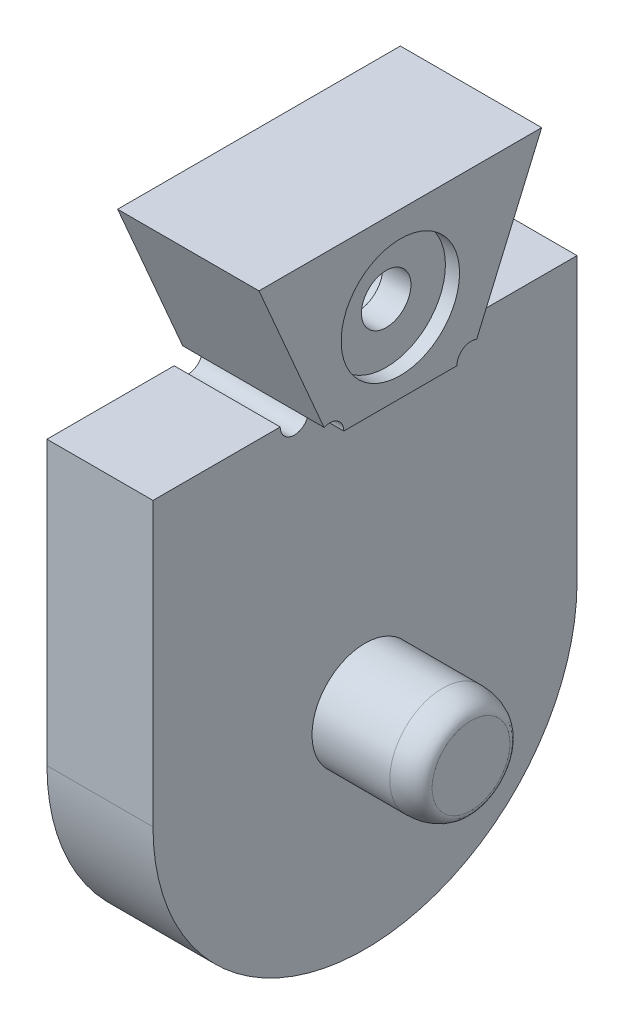
ISO-10303-21;
HEADER;
FILE_DESCRIPTION(('STEP AP214'),'2;1');
FILE_NAME('part.step','',(''),(''),'','','');
FILE_SCHEMA(('AUTOMOTIVE_DESIGN { 1 0 10303 214 1 1 1 1 }'));
ENDSEC;
DATA;
#1=APPLICATION_CONTEXT('core data for automotive mechanical design processes');
#2=APPLICATION_PROTOCOL_DEFINITION('international standard','automotive_design',2000,#1);
#3=PRODUCT_CONTEXT('',#1,'mechanical');
#4=PRODUCT('Part','Part','',(#3));
#5=PRODUCT_RELATED_PRODUCT_CATEGORY('part','',(#4));
#6=PRODUCT_DEFINITION_FORMATION('','',#4);
#7=PRODUCT_DEFINITION_CONTEXT('part definition',#1,'design');
#8=PRODUCT_DEFINITION('design','',#6,#7);
#9=PRODUCT_DEFINITION_SHAPE('','',#8);
#10=(LENGTH_UNIT() NAMED_UNIT(*) SI_UNIT(.MILLI.,.METRE.));
#11=(NAMED_UNIT(*) PLANE_ANGLE_UNIT() SI_UNIT($,.RADIAN.));
#12=(NAMED_UNIT(*) SI_UNIT($,.STERADIAN.) SOLID_ANGLE_UNIT());
#13=UNCERTAINTY_MEASURE_WITH_UNIT(LENGTH_MEASURE(1.E-05),#10,'distance_accuracy_value','');
#14=(GEOMETRIC_REPRESENTATION_CONTEXT(3) GLOBAL_UNCERTAINTY_ASSIGNED_CONTEXT((#13)) GLOBAL_UNIT_ASSIGNED_CONTEXT((#10,
#11,#12)) REPRESENTATION_CONTEXT('',''));
#15=CARTESIAN_POINT('',(0.,0.,0.));
#16=DIRECTION('',(0.,0.,1.));
#17=DIRECTION('',(1.,0.,0.));
#18=AXIS2_PLACEMENT_3D('',#15,#16,#17);
#19=CARTESIAN_POINT('',(0.,40.,20.95));
#20=DIRECTION('',(0.,0.,1.));
#21=DIRECTION('',(1.,0.,0.));
#22=AXIS2_PLACEMENT_3D('',#19,#20,#21);
#23=PLANE('',#22);
#24=DIRECTION('',(0.,1.,0.));
#25=VECTOR('',#24,1.);
#26=CARTESIAN_POINT('',(-15.5,-0.000100000000252674,20.95));
#27=LINE('',#26,#25);
#28=CARTESIAN_POINT('',(-15.5,-20.0001000000003,20.95));
#29=VERTEX_POINT('',#28);
#30=CARTESIAN_POINT('',(-15.5,-9.99999997853921E-05,20.95));
#31=VERTEX_POINT('',#30);
#32=EDGE_CURVE('E191',#29,#31,#27,.T.);
#33=ORIENTED_EDGE('',*,*,#32,.T.);
#34=DIRECTION('',(-1.,0.,0.));
#35=VECTOR('',#34,1.);
#36=CARTESIAN_POINT('',(25.5,-9.99999997818359E-05,20.95));
#37=LINE('',#36,#35);
#38=CARTESIAN_POINT('',(-23.,-9.99999997860426E-05,20.95));
#39=VERTEX_POINT('',#38);
#40=EDGE_CURVE('E179',#31,#39,#37,.T.);
#41=ORIENTED_EDGE('',*,*,#40,.T.);
#42=DIRECTION('',(0.,-1.,0.));
#43=VECTOR('',#42,1.);
#44=CARTESIAN_POINT('',(-23.,40.,20.95));
#45=LINE('',#44,#43);
#46=CARTESIAN_POINT('',(-23.,-20.0001000000003,20.95));
#47=VERTEX_POINT('',#46);
#48=EDGE_CURVE('E211',#39,#47,#45,.T.);
#49=ORIENTED_EDGE('',*,*,#48,.T.);
#50=DIRECTION('',(-1.,0.,0.));
#51=VECTOR('',#50,1.);
#52=CARTESIAN_POINT('',(-15.5,-20.0001000000003,20.95));
#53=LINE('',#52,#51);
#54=EDGE_CURVE('E201',#29,#47,#53,.T.);
#55=ORIENTED_EDGE('',*,*,#54,.F.);
#56=EDGE_LOOP('',(#33,#41,#49,#55));
#57=FACE_BOUND('',#56,.T.);
#58=ADVANCED_FACE('F52',(#57),#23,.T.);
#59=CARTESIAN_POINT('',(-15.5,-20.0001000000003,5.95));
#60=DIRECTION('',(-1.,0.,0.));
#61=DIRECTION('',(0.,-1.,0.));
#62=AXIS2_PLACEMENT_3D('',#59,#60,#61);
#63=CYLINDRICAL_SURFACE('',#62,15.);
#64=CARTESIAN_POINT('',(-23.,-20.0001000000003,5.95));
#65=DIRECTION('',(-1.,0.,0.));
#66=DIRECTION('',(0.,-1.,0.));
#67=AXIS2_PLACEMENT_3D('',#64,#65,#66);
#68=CIRCLE('',#67,15.);
#69=CARTESIAN_POINT('',(-23.,-20.0001000000003,-9.05));
#70=VERTEX_POINT('',#69);
#71=EDGE_CURVE('E187',#70,#47,#68,.T.);
#72=ORIENTED_EDGE('',*,*,#71,.F.);
#73=DIRECTION('',(-1.,0.,0.));
#74=VECTOR('',#73,1.);
#75=CARTESIAN_POINT('',(-15.5,-20.0001000000003,-9.05));
#76=LINE('',#75,#74);
#77=CARTESIAN_POINT('',(-15.5,-20.0001000000003,-9.05));
#78=VERTEX_POINT('',#77);
#79=EDGE_CURVE('E204',#78,#70,#76,.T.);
#80=ORIENTED_EDGE('',*,*,#79,.F.);
#81=CARTESIAN_POINT('',(-15.5,-20.0001000000003,5.95));
#82=DIRECTION('',(-1.,0.,0.));
#83=DIRECTION('',(0.,-1.,0.));
#84=AXIS2_PLACEMENT_3D('',#81,#82,#83);
#85=CIRCLE('',#84,15.);
#86=EDGE_CURVE('E188',#78,#29,#85,.T.);
#87=ORIENTED_EDGE('',*,*,#86,.T.);
#88=ORIENTED_EDGE('',*,*,#54,.T.);
#89=EDGE_LOOP('',(#72,#80,#87,#88));
#90=FACE_BOUND('',#89,.T.);
#91=ADVANCED_FACE('F253',(#90),#63,.T.);
#92=CARTESIAN_POINT('',(0.,40.,-9.05));
#93=DIRECTION('',(0.,0.,1.));
#94=DIRECTION('',(1.,0.,0.));
#95=AXIS2_PLACEMENT_3D('',#92,#93,#94);
#96=PLANE('',#95);
#97=DIRECTION('',(-1.,0.,0.));
#98=VECTOR('',#97,1.);
#99=CARTESIAN_POINT('',(25.5,-9.99999997818359E-05,-9.05));
#100=LINE('',#99,#98);
#101=CARTESIAN_POINT('',(-15.5,-9.99999997853921E-05,-9.05));
#102=VERTEX_POINT('',#101);
#103=CARTESIAN_POINT('',(-23.,-9.99999997860426E-05,-9.05));
#104=VERTEX_POINT('',#103);
#105=EDGE_CURVE('E164',#102,#104,#100,.T.);
#106=ORIENTED_EDGE('',*,*,#105,.F.);
#107=DIRECTION('',(0.,-1.,0.));
#108=VECTOR('',#107,1.);
#109=CARTESIAN_POINT('',(-15.5,-20.0001000000003,-9.05));
#110=LINE('',#109,#108);
#111=EDGE_CURVE('E198',#102,#78,#110,.T.);
#112=ORIENTED_EDGE('',*,*,#111,.T.);
#113=ORIENTED_EDGE('',*,*,#79,.T.);
#114=DIRECTION('',(0.,-1.,0.));
#115=VECTOR('',#114,1.);
#116=CARTESIAN_POINT('',(-23.,40.,-9.05));
#117=LINE('',#116,#115);
#118=EDGE_CURVE('E207',#104,#70,#117,.T.);
#119=ORIENTED_EDGE('',*,*,#118,.F.);
#120=EDGE_LOOP('',(#106,#112,#113,#119));
#121=FACE_BOUND('',#120,.T.);
#122=ADVANCED_FACE('F251',(#121),#96,.F.);
#123=CARTESIAN_POINT('',(-15.5,-20.0001000000003,5.95));
#124=DIRECTION('',(-1.,0.,0.));
#125=DIRECTION('',(0.,-1.,0.));
#126=AXIS2_PLACEMENT_3D('',#123,#124,#125);
#127=PLANE('',#126);
#128=DIRECTION('',(0.,0.,-1.));
#129=VECTOR('',#128,1.);
#130=CARTESIAN_POINT('',(-15.5,-9.99999997843004E-05,5.94999999999999));
#131=LINE('',#130,#129);
#132=CARTESIAN_POINT('',(-15.5,-9.99999997837388E-05,-0.0500000000000006));
#133=VERTEX_POINT('',#132);
#134=EDGE_CURVE('E178',#133,#102,#131,.T.);
#135=ORIENTED_EDGE('',*,*,#134,.F.);
#136=CARTESIAN_POINT('',(-15.5,-9.99999997835551E-05,0.95));
#137=DIRECTION('',(-1.,0.,0.));
#138=DIRECTION('',(0.,-1.,0.));
#139=AXIS2_PLACEMENT_3D('',#136,#137,#138);
#140=CIRCLE('',#139,1.);
#141=CARTESIAN_POINT('',(-15.5,-9.99999998900245E-05,1.95));
#142=VERTEX_POINT('',#141);
#143=EDGE_CURVE('E147',#133,#142,#140,.T.);
#144=ORIENTED_EDGE('',*,*,#143,.T.);
#145=DIRECTION('',(0.,0.,-1.));
#146=VECTOR('',#145,1.);
#147=CARTESIAN_POINT('',(-15.5,-9.99999996793117E-05,-9.05));
#148=LINE('',#147,#146);
#149=CARTESIAN_POINT('',(-15.5,-9.99999998900245E-05,9.95));
#150=VERTEX_POINT('',#149);
#151=EDGE_CURVE('E194',#150,#142,#148,.T.);
#152=ORIENTED_EDGE('',*,*,#151,.F.);
#153=CARTESIAN_POINT('',(-15.5,-9.99999997817181E-05,10.95));
#154=DIRECTION('',(-1.,0.,0.));
#155=DIRECTION('',(0.,-1.,0.));
#156=AXIS2_PLACEMENT_3D('',#153,#154,#155);
#157=CIRCLE('',#156,0.999999999999997);
#158=CARTESIAN_POINT('',(-15.5,-9.99999997854317E-05,11.95));
#159=VERTEX_POINT('',#158);
#160=EDGE_CURVE('E315',#150,#159,#157,.T.);
#161=ORIENTED_EDGE('',*,*,#160,.T.);
#162=EDGE_CURVE('E195',#31,#159,#148,.T.);
#163=ORIENTED_EDGE('',*,*,#162,.F.);
#164=ORIENTED_EDGE('',*,*,#32,.F.);
#165=ORIENTED_EDGE('',*,*,#86,.F.);
#166=ORIENTED_EDGE('',*,*,#111,.F.);
#167=EDGE_LOOP('',(#135,#144,#152,#161,#163,#164,#165,#166));
#168=FACE_BOUND('',#167,.T.);
#169=CARTESIAN_POINT('',(-15.5,-20.0001000000003,5.95));
#170=DIRECTION('',(-1.,0.,0.));
#171=DIRECTION('',(0.,-1.,0.));
#172=AXIS2_PLACEMENT_3D('',#169,#170,#171);
#173=CIRCLE('',#172,3.75);
#174=CARTESIAN_POINT('',(-15.5,-23.7501000000003,5.95));
#175=VERTEX_POINT('',#174);
#176=EDGE_CURVE('E322',#175,#175,#173,.F.);
#177=ORIENTED_EDGE('',*,*,#176,.F.);
#178=EDGE_LOOP('',(#177));
#179=FACE_BOUND('',#178,.T.);
#180=ADVANCED_FACE('F247',(#168,#179),#127,.F.);
#181=CARTESIAN_POINT('',(25.5,-9.99999997781619E-05,10.95));
#182=DIRECTION('',(0.,1.,0.));
#183=DIRECTION('',(0.,0.,1.));
#184=AXIS2_PLACEMENT_3D('',#181,#182,#183);
#185=PLANE('',#184);
#186=DIRECTION('',(-1.,0.,0.));
#187=VECTOR('',#186,1.);
#188=CARTESIAN_POINT('',(-7.99,-9.99999997847802E-05,11.95));
#189=LINE('',#188,#187);
#190=CARTESIAN_POINT('',(-23.,-9.99999997860822E-05,11.95));
#191=VERTEX_POINT('',#190);
#192=EDGE_CURVE('E310',#159,#191,#189,.T.);
#193=ORIENTED_EDGE('',*,*,#192,.T.);
#194=DIRECTION('',(0.,0.,-1.));
#195=VECTOR('',#194,1.);
#196=CARTESIAN_POINT('',(-23.,-9.99999997823686E-05,10.95));
#197=LINE('',#196,#195);
#198=EDGE_CURVE('E166',#39,#191,#197,.T.);
#199=ORIENTED_EDGE('',*,*,#198,.F.);
#200=ORIENTED_EDGE('',*,*,#40,.F.);
#201=ORIENTED_EDGE('',*,*,#162,.T.);
#202=EDGE_LOOP('',(#193,#199,#200,#201));
#203=FACE_BOUND('',#202,.T.);
#204=ADVANCED_FACE('F250',(#203),#185,.T.);
#205=CARTESIAN_POINT('',(-23.,40.,20.95));
#206=DIRECTION('',(1.,0.,0.));
#207=DIRECTION('',(0.,1.,0.));
#208=AXIS2_PLACEMENT_3D('',#205,#206,#207);
#209=PLANE('',#208);
#210=CARTESIAN_POINT('',(-23.,5.59000000000001,5.94999999999999));
#211=DIRECTION('',(-1.,0.,0.));
#212=DIRECTION('',(0.,-1.,0.));
#213=AXIS2_PLACEMENT_3D('',#210,#211,#212);
#214=CIRCLE('',#213,2.75);
#215=CARTESIAN_POINT('',(-23.,2.84000000000001,5.94999999999999));
#216=VERTEX_POINT('',#215);
#217=EDGE_CURVE('E279',#216,#216,#214,.T.);
#218=ORIENTED_EDGE('',*,*,#217,.F.);
#219=EDGE_LOOP('',(#218));
#220=FACE_BOUND('',#219,.T.);
#221=DIRECTION('',(0.,-0.91820115627654,0.39611442363593));
#222=VECTOR('',#221,1.);
#223=CARTESIAN_POINT('',(-23.,11.59,-4.05000000000001));
#224=LINE('',#223,#222);
#225=CARTESIAN_POINT('',(-23.,11.59,-4.05000000000001));
#226=VERTEX_POINT('',#225);
#227=CARTESIAN_POINT('',(-23.,0.918101156276756,0.553885576364069));
#228=VERTEX_POINT('',#227);
#229=EDGE_CURVE('E159',#226,#228,#224,.T.);
#230=ORIENTED_EDGE('',*,*,#229,.T.);
#231=CARTESIAN_POINT('',(-23.,-9.99999997842056E-05,0.95));
#232=DIRECTION('',(-1.,0.,0.));
#233=DIRECTION('',(0.,1.,0.));
#234=AXIS2_PLACEMENT_3D('',#231,#232,#233);
#235=CIRCLE('',#234,1.);
#236=CARTESIAN_POINT('',(-23.,-9.99999997843893E-05,-0.0500000000000006));
#237=VERTEX_POINT('',#236);
#238=EDGE_CURVE('E145',#237,#228,#235,.T.);
#239=ORIENTED_EDGE('',*,*,#238,.F.);
#240=DIRECTION('',(0.,0.,-1.));
#241=VECTOR('',#240,1.);
#242=CARTESIAN_POINT('',(-23.,-9.99999997842056E-05,0.95));
#243=LINE('',#242,#241);
#244=EDGE_CURVE('E155',#237,#104,#243,.T.);
#245=ORIENTED_EDGE('',*,*,#244,.T.);
#246=ORIENTED_EDGE('',*,*,#118,.T.);
#247=ORIENTED_EDGE('',*,*,#71,.T.);
#248=ORIENTED_EDGE('',*,*,#48,.F.);
#249=ORIENTED_EDGE('',*,*,#198,.T.);
#250=CARTESIAN_POINT('',(-23.,-9.99999997823686E-05,10.95));
#251=DIRECTION('',(-1.,0.,0.));
#252=DIRECTION('',(0.,1.,0.));
#253=AXIS2_PLACEMENT_3D('',#250,#251,#252);
#254=CIRCLE('',#253,0.999999999999997);
#255=CARTESIAN_POINT('',(-23.,0.918101156276756,11.3461144236359));
#256=VERTEX_POINT('',#255);
#257=EDGE_CURVE('E160',#256,#191,#254,.T.);
#258=ORIENTED_EDGE('',*,*,#257,.F.);
#259=DIRECTION('',(0.,0.918201156276541,0.396114423635929));
#260=VECTOR('',#259,1.);
#261=CARTESIAN_POINT('',(-23.,11.59,15.95));
#262=LINE('',#261,#260);
#263=CARTESIAN_POINT('',(-23.,11.59,15.95));
#264=VERTEX_POINT('',#263);
#265=EDGE_CURVE('E169',#256,#264,#262,.T.);
#266=ORIENTED_EDGE('',*,*,#265,.T.);
#267=DIRECTION('',(0.,0.,1.));
#268=VECTOR('',#267,1.);
#269=CARTESIAN_POINT('',(-23.,11.59,-9.05));
#270=LINE('',#269,#268);
#271=EDGE_CURVE('E184',#226,#264,#270,.T.);
#272=ORIENTED_EDGE('',*,*,#271,.F.);
#273=EDGE_LOOP('',(#230,#239,#245,#246,#247,#248,#249,#258,#266,#272));
#274=FACE_BOUND('',#273,.T.);
#275=ADVANCED_FACE('F154',(#220,#274),#209,.F.);
#276=CARTESIAN_POINT('',(25.5,-9.99999997799989E-05,0.95));
#277=DIRECTION('',(0.,1.,0.));
#278=DIRECTION('',(0.,0.,1.));
#279=AXIS2_PLACEMENT_3D('',#276,#277,#278);
#280=PLANE('',#279);
#281=DIRECTION('',(-1.,0.,0.));
#282=VECTOR('',#281,1.);
#283=CARTESIAN_POINT('',(-7.99,-9.99999997830874E-05,-0.0500000000000006));
#284=LINE('',#283,#282);
#285=EDGE_CURVE('E142',#133,#237,#284,.T.);
#286=ORIENTED_EDGE('',*,*,#285,.F.);
#287=ORIENTED_EDGE('',*,*,#134,.T.);
#288=ORIENTED_EDGE('',*,*,#105,.T.);
#289=ORIENTED_EDGE('',*,*,#244,.F.);
#290=EDGE_LOOP('',(#286,#287,#288,#289));
#291=FACE_BOUND('',#290,.T.);
#292=ADVANCED_FACE('F162',(#291),#280,.T.);
#293=CARTESIAN_POINT('',(25.5,11.59,-4.05000000000001));
#294=DIRECTION('',(0.,-0.39611442363593,-0.91820115627654));
#295=DIRECTION('',(0.,0.91820115627654,-0.39611442363593));
#296=AXIS2_PLACEMENT_3D('',#293,#294,#295);
#297=PLANE('',#296);
#298=DIRECTION('',(-1.,0.,0.));
#299=VECTOR('',#298,1.);
#300=CARTESIAN_POINT('',(-7.99,0.918101156276757,0.553885576364069));
#301=LINE('',#300,#299);
#302=CARTESIAN_POINT('',(-13.,0.918101156276756,0.553885576364069));
#303=VERTEX_POINT('',#302);
#304=EDGE_CURVE('E71',#303,#228,#301,.T.);
#305=ORIENTED_EDGE('',*,*,#304,.T.);
#306=ORIENTED_EDGE('',*,*,#229,.F.);
#307=DIRECTION('',(-1.,0.,0.));
#308=VECTOR('',#307,1.);
#309=CARTESIAN_POINT('',(25.5,11.59,-4.05000000000001));
#310=LINE('',#309,#308);
#311=CARTESIAN_POINT('',(-13.,11.59,-4.05000000000001));
#312=VERTEX_POINT('',#311);
#313=EDGE_CURVE('E176',#312,#226,#310,.T.);
#314=ORIENTED_EDGE('',*,*,#313,.F.);
#315=DIRECTION('',(0.,0.91820115627654,-0.39611442363593));
#316=VECTOR('',#315,1.);
#317=CARTESIAN_POINT('',(-13.,11.59,-4.05000000000001));
#318=LINE('',#317,#316);
#319=EDGE_CURVE('E216',#303,#312,#318,.T.);
#320=ORIENTED_EDGE('',*,*,#319,.F.);
#321=EDGE_LOOP('',(#305,#306,#314,#320));
#322=FACE_BOUND('',#321,.T.);
#323=ADVANCED_FACE('F273',(#322),#297,.T.);
#324=CARTESIAN_POINT('',(25.5,11.59,15.95));
#325=DIRECTION('',(0.,-0.396114423635929,0.918201156276541));
#326=DIRECTION('',(0.,-0.918201156276541,-0.396114423635929));
#327=AXIS2_PLACEMENT_3D('',#324,#325,#326);
#328=PLANE('',#327);
#329=DIRECTION('',(-1.,0.,0.));
#330=VECTOR('',#329,1.);
#331=CARTESIAN_POINT('',(-7.99,0.918101156276757,11.3461144236359));
#332=LINE('',#331,#330);
#333=CARTESIAN_POINT('',(-13.,0.918101156276757,11.3461144236359));
#334=VERTEX_POINT('',#333);
#335=EDGE_CURVE('E303',#334,#256,#332,.T.);
#336=ORIENTED_EDGE('',*,*,#335,.F.);
#337=DIRECTION('',(0.,-0.918201156276541,-0.396114423635929));
#338=VECTOR('',#337,1.);
#339=CARTESIAN_POINT('',(-13.,11.59,15.95));
#340=LINE('',#339,#338);
#341=CARTESIAN_POINT('',(-13.,11.59,15.95));
#342=VERTEX_POINT('',#341);
#343=EDGE_CURVE('E171',#342,#334,#340,.T.);
#344=ORIENTED_EDGE('',*,*,#343,.F.);
#345=DIRECTION('',(-1.,0.,0.));
#346=VECTOR('',#345,1.);
#347=CARTESIAN_POINT('',(-7.65,11.59,15.95));
#348=LINE('',#347,#346);
#349=EDGE_CURVE('E213',#342,#264,#348,.T.);
#350=ORIENTED_EDGE('',*,*,#349,.T.);
#351=ORIENTED_EDGE('',*,*,#265,.F.);
#352=EDGE_LOOP('',(#336,#344,#350,#351));
#353=FACE_BOUND('',#352,.T.);
#354=ADVANCED_FACE('F301',(#353),#328,.T.);
#355=CARTESIAN_POINT('',(-7.65,11.59,-15.4932243254915));
#356=DIRECTION('',(0.,-1.,0.));
#357=DIRECTION('',(0.,0.,-1.));
#358=AXIS2_PLACEMENT_3D('',#355,#356,#357);
#359=PLANE('',#358);
#360=ORIENTED_EDGE('',*,*,#349,.F.);
#361=DIRECTION('',(0.,0.,1.));
#362=VECTOR('',#361,1.);
#363=CARTESIAN_POINT('',(-13.,11.59,-9.05));
#364=LINE('',#363,#362);
#365=EDGE_CURVE('E284',#312,#342,#364,.T.);
#366=ORIENTED_EDGE('',*,*,#365,.F.);
#367=ORIENTED_EDGE('',*,*,#313,.T.);
#368=ORIENTED_EDGE('',*,*,#271,.T.);
#369=EDGE_LOOP('',(#360,#366,#367,#368));
#370=FACE_BOUND('',#369,.T.);
#371=ADVANCED_FACE('F245',(#370),#359,.F.);
#372=CARTESIAN_POINT('',(0.,-0.0001,0.));
#373=DIRECTION('',(0.,1.,0.));
#374=DIRECTION('',(-1.,0.,0.));
#375=AXIS2_PLACEMENT_3D('',#372,#373,#374);
#376=PLANE('',#375);
#377=ORIENTED_EDGE('',*,*,#151,.T.);
#378=DIRECTION('',(-1.,0.,0.));
#379=VECTOR('',#378,1.);
#380=CARTESIAN_POINT('',(-7.99,-9.99999998893731E-05,1.95));
#381=LINE('',#380,#379);
#382=CARTESIAN_POINT('',(-13.,-9.99999998200062E-05,1.95));
#383=VERTEX_POINT('',#382);
#384=EDGE_CURVE('E318',#142,#383,#381,.F.);
#385=ORIENTED_EDGE('',*,*,#384,.T.);
#386=DIRECTION('',(0.,0.,1.));
#387=VECTOR('',#386,1.);
#388=CARTESIAN_POINT('',(-13.,-9.99999998200062E-05,0.));
#389=LINE('',#388,#387);
#390=CARTESIAN_POINT('',(-13.,-9.99999998200062E-05,9.95));
#391=VERTEX_POINT('',#390);
#392=EDGE_CURVE('E291',#383,#391,#389,.T.);
#393=ORIENTED_EDGE('',*,*,#392,.T.);
#394=DIRECTION('',(-1.,0.,0.));
#395=VECTOR('',#394,1.);
#396=CARTESIAN_POINT('',(-7.99,-9.99999998893731E-05,9.95));
#397=LINE('',#396,#395);
#398=EDGE_CURVE('E78',#391,#150,#397,.T.);
#399=ORIENTED_EDGE('',*,*,#398,.T.);
#400=EDGE_LOOP('',(#377,#385,#393,#399));
#401=FACE_BOUND('',#400,.T.);
#402=ADVANCED_FACE('F257',(#401),#376,.F.);
#403=CARTESIAN_POINT('',(-13.,-14.41,-9.05));
#404=DIRECTION('',(-1.,0.,0.));
#405=DIRECTION('',(0.,0.,1.));
#406=AXIS2_PLACEMENT_3D('',#403,#404,#405);
#407=PLANE('',#406);
#408=CARTESIAN_POINT('',(-13.,5.59000000000001,5.95));
#409=DIRECTION('',(1.,0.,0.));
#410=DIRECTION('',(0.,0.,-1.));
#411=AXIS2_PLACEMENT_3D('',#408,#409,#410);
#412=CIRCLE('',#411,4.18865338134376);
#413=CARTESIAN_POINT('',(-13.,5.59000000000001,1.76134661865623));
#414=VERTEX_POINT('',#413);
#415=EDGE_CURVE('E325',#414,#414,#412,.T.);
#416=ORIENTED_EDGE('',*,*,#415,.F.);
#417=EDGE_LOOP('',(#416));
#418=FACE_BOUND('',#417,.T.);
#419=ORIENTED_EDGE('',*,*,#392,.F.);
#420=CARTESIAN_POINT('',(-13.,-9.99999997833383E-05,0.95));
#421=DIRECTION('',(-1.,0.,0.));
#422=DIRECTION('',(0.,0.,1.));
#423=AXIS2_PLACEMENT_3D('',#420,#421,#422);
#424=CIRCLE('',#423,1.);
#425=EDGE_CURVE('E14',#383,#303,#424,.T.);
#426=ORIENTED_EDGE('',*,*,#425,.T.);
#427=ORIENTED_EDGE('',*,*,#319,.T.);
#428=ORIENTED_EDGE('',*,*,#365,.T.);
#429=ORIENTED_EDGE('',*,*,#343,.T.);
#430=CARTESIAN_POINT('',(-13.,-9.99999997815013E-05,10.95));
#431=DIRECTION('',(-1.,0.,0.));
#432=DIRECTION('',(0.,0.,1.));
#433=AXIS2_PLACEMENT_3D('',#430,#431,#432);
#434=CIRCLE('',#433,0.999999999999997);
#435=EDGE_CURVE('E64',#334,#391,#434,.T.);
#436=ORIENTED_EDGE('',*,*,#435,.T.);
#437=EDGE_LOOP('',(#419,#426,#427,#428,#429,#436));
#438=FACE_BOUND('',#437,.T.);
#439=ADVANCED_FACE('F260',(#418,#438),#407,.F.);
#440=CARTESIAN_POINT('',(-5.22182540694799,5.59000000000001,5.94999999999999));
#441=DIRECTION('',(-1.,0.,0.));
#442=DIRECTION('',(0.,-1.,0.));
#443=AXIS2_PLACEMENT_3D('',#440,#441,#442);
#444=CYLINDRICAL_SURFACE('',#443,2.75);
#445=CARTESIAN_POINT('',(-16.,5.59000000000001,5.94999999999999));
#446=DIRECTION('',(-1.,0.,0.));
#447=DIRECTION('',(0.,0.,1.));
#448=AXIS2_PLACEMENT_3D('',#445,#446,#447);
#449=CIRCLE('',#448,2.75);
#450=CARTESIAN_POINT('',(-16.,5.59000000000001,8.69999999999999));
#451=VERTEX_POINT('',#450);
#452=EDGE_CURVE('E281',#451,#451,#449,.F.);
#453=ORIENTED_EDGE('',*,*,#452,.T.);
#454=EDGE_LOOP('',(#453));
#455=FACE_BOUND('',#454,.T.);
#456=ORIENTED_EDGE('',*,*,#217,.T.);
#457=EDGE_LOOP('',(#456));
#458=FACE_BOUND('',#457,.T.);
#459=ADVANCED_FACE('F354',(#455,#458),#444,.F.);
#460=CARTESIAN_POINT('',(-16.,-14.41,-9.05));
#461=DIRECTION('',(-1.,0.,0.));
#462=DIRECTION('',(0.,0.,1.));
#463=AXIS2_PLACEMENT_3D('',#460,#461,#462);
#464=PLANE('',#463);
#465=CARTESIAN_POINT('',(-16.,5.59000000000001,5.95));
#466=DIRECTION('',(-1.,0.,0.));
#467=DIRECTION('',(0.,-1.,0.));
#468=AXIS2_PLACEMENT_3D('',#465,#466,#467);
#469=CIRCLE('',#468,1.75);
#470=CARTESIAN_POINT('',(-16.,3.84000000000001,5.95));
#471=VERTEX_POINT('',#470);
#472=EDGE_CURVE('E222',#471,#471,#469,.T.);
#473=ORIENTED_EDGE('',*,*,#472,.F.);
#474=EDGE_LOOP('',(#473));
#475=FACE_BOUND('',#474,.T.);
#476=ORIENTED_EDGE('',*,*,#452,.F.);
#477=EDGE_LOOP('',(#476));
#478=FACE_BOUND('',#477,.T.);
#479=ADVANCED_FACE('F350',(#475,#478),#464,.T.);
#480=CARTESIAN_POINT('',(-6.,5.59000000000001,5.95));
#481=DIRECTION('',(-1.,0.,0.));
#482=DIRECTION('',(0.,-1.,0.));
#483=AXIS2_PLACEMENT_3D('',#480,#481,#482);
#484=CYLINDRICAL_SURFACE('',#483,1.75);
#485=CARTESIAN_POINT('',(-14.,5.59000000000001,5.95));
#486=DIRECTION('',(-1.,0.,0.));
#487=DIRECTION('',(0.,0.,1.));
#488=AXIS2_PLACEMENT_3D('',#485,#486,#487);
#489=CIRCLE('',#488,1.75);
#490=CARTESIAN_POINT('',(-14.,5.59000000000001,7.7));
#491=VERTEX_POINT('',#490);
#492=EDGE_CURVE('E219',#491,#491,#489,.F.);
#493=ORIENTED_EDGE('',*,*,#492,.T.);
#494=EDGE_LOOP('',(#493));
#495=FACE_BOUND('',#494,.T.);
#496=ORIENTED_EDGE('',*,*,#472,.T.);
#497=EDGE_LOOP('',(#496));
#498=FACE_BOUND('',#497,.T.);
#499=ADVANCED_FACE('F343',(#495,#498),#484,.F.);
#500=CARTESIAN_POINT('',(-14.,-14.41,-9.05));
#501=DIRECTION('',(-1.,0.,0.));
#502=DIRECTION('',(0.,0.,1.));
#503=AXIS2_PLACEMENT_3D('',#500,#501,#502);
#504=PLANE('',#503);
#505=CARTESIAN_POINT('',(-14.,5.59000000000001,5.95));
#506=DIRECTION('',(-1.,0.,0.));
#507=DIRECTION('',(0.,0.,1.));
#508=AXIS2_PLACEMENT_3D('',#505,#506,#507);
#509=CIRCLE('',#508,4.18865338134376);
#510=CARTESIAN_POINT('',(-14.,5.59000000000001,10.1386533813438));
#511=VERTEX_POINT('',#510);
#512=EDGE_CURVE('E223',#511,#511,#509,.F.);
#513=ORIENTED_EDGE('',*,*,#512,.T.);
#514=EDGE_LOOP('',(#513));
#515=FACE_BOUND('',#514,.T.);
#516=ORIENTED_EDGE('',*,*,#492,.F.);
#517=EDGE_LOOP('',(#516));
#518=FACE_BOUND('',#517,.T.);
#519=ADVANCED_FACE('F330',(#515,#518),#504,.F.);
#520=CARTESIAN_POINT('',(-27.8473008399525,5.59000000000001,5.95));
#521=DIRECTION('',(1.,0.,0.));
#522=DIRECTION('',(0.,0.,-1.));
#523=AXIS2_PLACEMENT_3D('',#520,#521,#522);
#524=CYLINDRICAL_SURFACE('',#523,4.18865338134376);
#525=ORIENTED_EDGE('',*,*,#415,.T.);
#526=EDGE_LOOP('',(#525));
#527=FACE_BOUND('',#526,.T.);
#528=ORIENTED_EDGE('',*,*,#512,.F.);
#529=EDGE_LOOP('',(#528));
#530=FACE_BOUND('',#529,.T.);
#531=ADVANCED_FACE('F333',(#527,#530),#524,.F.);
#532=CARTESIAN_POINT('',(-26.8137084989848,-20.0001000000003,5.95));
#533=DIRECTION('',(1.,0.,0.));
#534=DIRECTION('',(0.,1.,0.));
#535=AXIS2_PLACEMENT_3D('',#532,#533,#534);
#536=CYLINDRICAL_SURFACE('',#535,3.75);
#537=CARTESIAN_POINT('',(-10.,-16.2501000000003,5.95));
#538=CARTESIAN_POINT('',(-10.,-16.2501000000003,6.44087384130514));
#539=CARTESIAN_POINT('',(-10.,-16.347702466634,6.93155457634191));
#540=CARTESIAN_POINT('',(-10.,-16.723401039532,7.83857116639627));
#541=CARTESIAN_POINT('',(-10.,-17.0013493486565,8.25455020755523));
#542=CARTESIAN_POINT('',(-10.,-17.6955497924451,8.94875065134386));
#543=CARTESIAN_POINT('',(-10.,-18.111528833604,9.22669896046835));
#544=CARTESIAN_POINT('',(-10.,-19.0185454236584,9.60239753336629));
#545=CARTESIAN_POINT('',(-10.,-19.509226158695,9.69999999999999));
#546=CARTESIAN_POINT('',(-10.,-20.4909738413056,9.69999999999999));
#547=CARTESIAN_POINT('',(-10.,-20.9816545763427,9.60239753336607));
#548=CARTESIAN_POINT('',(-10.,-21.8886711663961,9.22669896046857));
#549=CARTESIAN_POINT('',(-10.,-22.3046502075558,8.94875065134361));
#550=CARTESIAN_POINT('',(-10.,-22.9988506513439,8.25455020755549));
#551=CARTESIAN_POINT('',(-10.,-23.2767989604686,7.83857116639649));
#552=CARTESIAN_POINT('',(-10.,-23.6524975333667,6.93155457634167));
#553=CARTESIAN_POINT('',(-10.,-23.7501000000003,6.44087384130572));
#554=CARTESIAN_POINT('',(-10.,-23.7501000000003,5.45912615869427));
#555=CARTESIAN_POINT('',(-10.,-23.6524975333668,4.96844542365859));
#556=CARTESIAN_POINT('',(-10.,-23.2767989604685,4.06142883360324));
#557=CARTESIAN_POINT('',(-10.,-22.9988506513434,3.645449792444));
#558=CARTESIAN_POINT('',(-10.,-22.3046502075563,2.9512493486569));
#559=CARTESIAN_POINT('',(-10.,-21.8886711663967,2.67330103953168));
#560=CARTESIAN_POINT('',(-10.,-20.9816545763421,2.29760246663367));
#561=CARTESIAN_POINT('',(-10.,-20.4909738413056,2.2));
#562=CARTESIAN_POINT('',(-10.,-19.509226158695,2.2));
#563=CARTESIAN_POINT('',(-10.,-19.0185454236585,2.29760246663367));
#564=CARTESIAN_POINT('',(-10.,-18.1115288336039,2.67330103953168));
#565=CARTESIAN_POINT('',(-10.,-17.695549792445,2.95124934865625));
#566=CARTESIAN_POINT('',(-10.,-17.0013493486566,3.64544979244464));
#567=CARTESIAN_POINT('',(-10.,-16.7234010395317,4.06142883360422));
#568=CARTESIAN_POINT('',(-10.,-16.3477024666342,4.96844542365761));
#569=CARTESIAN_POINT('',(-10.,-16.2501000000003,5.45912615869486));
#570=CARTESIAN_POINT('',(-10.,-16.2501000000003,5.95));
#571=(BOUNDED_CURVE() B_SPLINE_CURVE(3,(#537,#538,#539,#540,#541,#542,#543,#544,#545,#546,#547,
#548,#549,#550,#551,#552,#553,#554,#555,#556,#557,#558,#559,#560,#561,#562,#563,#564,#565,#566,
#567,#568,#569,#570),.UNSPECIFIED.,.T.,.F.) B_SPLINE_CURVE_WITH_KNOTS((4,2,2,2,2,2,2,2,2,2,2,2,
2,2,2,2,4),(-3.14159265358979,-2.74889357189107,-2.35619449019234,-1.96349540849362,
-1.5707963267949,-1.17809724509617,-0.785398163397448,-0.392699081698724,0.,0.392699081698724,
0.785398163397448,1.17809724509617,1.5707963267949,1.96349540849362,2.35619449019234,
2.74889357189107,3.14159265358979),
.UNSPECIFIED.) CURVE() GEOMETRIC_REPRESENTATION_ITEM() RATIONAL_B_SPLINE_CURVE((1.,1.,1.,1.,1.,
1.,1.,1.,1.,1.,1.,1.,1.,1.,1.,1.,1.,1.,1.,1.,1.,1.,1.,1.,1.,1.,1.,1.,1.,1.,1.,1.,1.,1.)) REPRESENTATION_ITEM(''));
#572=CARTESIAN_POINT('',(-10.,-16.2501000000003,5.95));
#573=VERTEX_POINT('',#572);
#574=EDGE_CURVE('E389',#573,#573,#571,.F.);
#575=ORIENTED_EDGE('',*,*,#574,.T.);
#576=EDGE_LOOP('',(#575));
#577=FACE_BOUND('',#576,.T.);
#578=ORIENTED_EDGE('',*,*,#176,.T.);
#579=EDGE_LOOP('',(#578));
#580=FACE_BOUND('',#579,.T.);
#581=ADVANCED_FACE('F244',(#577,#580),#536,.T.);
#582=CARTESIAN_POINT('',(-8.,-20.0001000000003,5.95));
#583=DIRECTION('',(-1.,0.,0.));
#584=DIRECTION('',(0.,-1.,0.));
#585=AXIS2_PLACEMENT_3D('',#582,#583,#584);
#586=PLANE('',#585);
#587=CARTESIAN_POINT('',(-8.,-17.2501000000003,5.95));
#588=CARTESIAN_POINT('',(-8.,-17.2501000000003,5.59002584970956));
#589=CARTESIAN_POINT('',(-8.,-17.3216751421988,5.23019331068244));
#590=CARTESIAN_POINT('',(-8.,-17.5971874289898,4.56504781130957));
#591=CARTESIAN_POINT('',(-8.,-17.8010161890147,4.25999651445926));
#592=CARTESIAN_POINT('',(-8.,-18.3100965144599,3.75091618901472));
#593=CARTESIAN_POINT('',(-8.,-18.6151478113097,3.54708742898994));
#594=CARTESIAN_POINT('',(-8.,-19.280293310683,3.27157514219799));
#595=CARTESIAN_POINT('',(-8.,-19.6401258497098,3.2));
#596=CARTESIAN_POINT('',(-8.,-20.3600741502908,3.2));
#597=CARTESIAN_POINT('',(-8.,-20.7199066893177,3.27157514219799));
#598=CARTESIAN_POINT('',(-8.,-21.385052188691,3.54708742898994));
#599=CARTESIAN_POINT('',(-8.,-21.6901034855412,3.75091618901488));
#600=CARTESIAN_POINT('',(-8.,-22.1991838109854,4.25999651445911));
#601=CARTESIAN_POINT('',(-8.,-22.4030125710101,4.56504781130921));
#602=CARTESIAN_POINT('',(-8.,-22.6785248578026,5.2301933106828));
#603=CARTESIAN_POINT('',(-8.,-22.7501000000003,5.5900258497092));
#604=CARTESIAN_POINT('',(-8.,-22.7501000000003,6.30997415029079));
#605=CARTESIAN_POINT('',(-8.,-22.6785248578026,6.66980668931735));
#606=CARTESIAN_POINT('',(-8.,-22.4030125710101,7.33495218869063));
#607=CARTESIAN_POINT('',(-8.,-22.1991838109854,7.64000348554058));
#608=CARTESIAN_POINT('',(-8.,-21.6901034855412,8.14908381098543));
#609=CARTESIAN_POINT('',(-8.,-21.3850521886903,8.35291257101014));
#610=CARTESIAN_POINT('',(-8.,-20.7199066893183,8.62842485780193));
#611=CARTESIAN_POINT('',(-8.,-20.3600741502908,8.69999999999999));
#612=CARTESIAN_POINT('',(-8.,-19.6401258497098,8.69999999999999));
#613=CARTESIAN_POINT('',(-8.,-19.280293310683,8.62842485780193));
#614=CARTESIAN_POINT('',(-8.,-18.6151478113097,8.35291257101013));
#615=CARTESIAN_POINT('',(-8.,-18.3100965144599,8.14908381098527));
#616=CARTESIAN_POINT('',(-8.,-17.8010161890147,7.64000348554073));
#617=CARTESIAN_POINT('',(-8.,-17.5971874289898,7.33495218869059));
#618=CARTESIAN_POINT('',(-8.,-17.3216751421988,6.6698066893174));
#619=CARTESIAN_POINT('',(-8.,-17.2501000000003,6.30997415029044));
#620=CARTESIAN_POINT('',(-8.,-17.2501000000003,5.95));
#621=(BOUNDED_CURVE() B_SPLINE_CURVE(3,(#587,#588,#589,#590,#591,#592,#593,#594,#595,#596,#597,
#598,#599,#600,#601,#602,#603,#604,#605,#606,#607,#608,#609,#610,#611,#612,#613,#614,#615,#616,
#617,#618,#619,#620),.UNSPECIFIED.,.T.,.F.) B_SPLINE_CURVE_WITH_KNOTS((4,2,2,2,2,2,2,2,2,2,2,2,
2,2,2,2,4),(-3.14159265358979,-2.74889357189107,-2.35619449019234,-1.96349540849362,
-1.5707963267949,-1.17809724509617,-0.785398163397448,-0.392699081698724,0.,0.392699081698724,
0.785398163397448,1.17809724509617,1.5707963267949,1.96349540849362,2.35619449019234,
2.74889357189107,3.14159265358979),
.UNSPECIFIED.) CURVE() GEOMETRIC_REPRESENTATION_ITEM() RATIONAL_B_SPLINE_CURVE((1.,1.,1.,1.,1.,
1.,1.,1.,1.,1.,1.,1.,1.,1.,1.,1.,1.,1.,1.,1.,1.,1.,1.,1.,1.,1.,1.,1.,1.,1.,1.,1.,1.,1.)) REPRESENTATION_ITEM(''));
#622=CARTESIAN_POINT('',(-8.,-17.2501000000003,5.95));
#623=VERTEX_POINT('',#622);
#624=EDGE_CURVE('E218',#623,#623,#621,.F.);
#625=ORIENTED_EDGE('',*,*,#624,.T.);
#626=EDGE_LOOP('',(#625));
#627=FACE_BOUND('',#626,.T.);
#628=ADVANCED_FACE('F234',(#627),#586,.F.);
#629=CARTESIAN_POINT('',(-10.,-16.2501000000003,5.95));
#630=CARTESIAN_POINT('',(-10.,-16.2501000000003,5.45912615869486));
#631=CARTESIAN_POINT('',(-10.,-16.3477024666342,4.96844542365761));
#632=CARTESIAN_POINT('',(-10.,-16.7234010395317,4.06142883360422));
#633=CARTESIAN_POINT('',(-10.,-17.0013493486566,3.64544979244464));
#634=CARTESIAN_POINT('',(-10.,-17.695549792445,2.95124934865625));
#635=CARTESIAN_POINT('',(-10.,-18.1115288336039,2.67330103953168));
#636=CARTESIAN_POINT('',(-10.,-19.0185454236585,2.29760246663367));
#637=CARTESIAN_POINT('',(-10.,-19.509226158695,2.2));
#638=CARTESIAN_POINT('',(-10.,-20.4909738413056,2.2));
#639=CARTESIAN_POINT('',(-10.,-20.9816545763421,2.29760246663367));
#640=CARTESIAN_POINT('',(-10.,-21.8886711663967,2.67330103953168));
#641=CARTESIAN_POINT('',(-10.,-22.3046502075563,2.9512493486569));
#642=CARTESIAN_POINT('',(-10.,-22.9988506513434,3.645449792444));
#643=CARTESIAN_POINT('',(-10.,-23.2767989604685,4.06142883360324));
#644=CARTESIAN_POINT('',(-10.,-23.6524975333668,4.96844542365859));
#645=CARTESIAN_POINT('',(-10.,-23.7501000000003,5.45912615869427));
#646=CARTESIAN_POINT('',(-10.,-23.7501000000003,6.44087384130572));
#647=CARTESIAN_POINT('',(-10.,-23.6524975333667,6.93155457634167));
#648=CARTESIAN_POINT('',(-10.,-23.2767989604686,7.83857116639649));
#649=CARTESIAN_POINT('',(-10.,-22.9988506513439,8.25455020755549));
#650=CARTESIAN_POINT('',(-10.,-22.3046502075558,8.94875065134361));
#651=CARTESIAN_POINT('',(-10.,-21.8886711663961,9.22669896046857));
#652=CARTESIAN_POINT('',(-10.,-20.9816545763427,9.60239753336607));
#653=CARTESIAN_POINT('',(-10.,-20.4909738413056,9.69999999999999));
#654=CARTESIAN_POINT('',(-10.,-19.509226158695,9.69999999999999));
#655=CARTESIAN_POINT('',(-10.,-19.0185454236584,9.60239753336629));
#656=CARTESIAN_POINT('',(-10.,-18.111528833604,9.22669896046835));
#657=CARTESIAN_POINT('',(-10.,-17.6955497924451,8.94875065134386));
#658=CARTESIAN_POINT('',(-10.,-17.0013493486565,8.25455020755523));
#659=CARTESIAN_POINT('',(-10.,-16.723401039532,7.83857116639627));
#660=CARTESIAN_POINT('',(-10.,-16.347702466634,6.93155457634191));
#661=CARTESIAN_POINT('',(-10.,-16.2501000000003,6.44087384130514));
#662=CARTESIAN_POINT('',(-10.,-16.2501000000003,5.95));
#663=CARTESIAN_POINT('',(-8.,-16.2501000000003,5.95));
#664=CARTESIAN_POINT('',(-8.,-16.2501000000003,5.45912615869486));
#665=CARTESIAN_POINT('',(-8.,-16.3477024666346,4.96844542365778));
#666=CARTESIAN_POINT('',(-8.,-16.7234010395313,4.06142883360406));
#667=CARTESIAN_POINT('',(-8.,-17.0013493486565,3.64544979244453));
#668=CARTESIAN_POINT('',(-8.,-17.6955497924451,2.95124934865636));
#669=CARTESIAN_POINT('',(-8.,-18.1115288336039,2.67330103953169));
#670=CARTESIAN_POINT('',(-8.,-19.0185454236585,2.29760246663366));
#671=CARTESIAN_POINT('',(-8.,-19.509226158695,2.2));
#672=CARTESIAN_POINT('',(-8.,-20.4909738413056,2.2));
#673=CARTESIAN_POINT('',(-8.,-20.9816545763421,2.29760246663366));
#674=CARTESIAN_POINT('',(-8.,-21.8886711663967,2.67330103953169));
#675=CARTESIAN_POINT('',(-8.00000000000031,-22.3046502075566,2.95124934865693));
#676=CARTESIAN_POINT('',(-7.99999999999968,-22.9988506513432,3.64544979244396));
#677=CARTESIAN_POINT('',(-8.,-23.2767989604679,4.06142883360347));
#678=CARTESIAN_POINT('',(-8.,-23.6524975333674,4.96844542365836));
#679=CARTESIAN_POINT('',(-8.,-23.7501000000003,5.45912615869427));
#680=CARTESIAN_POINT('',(-8.,-23.7501000000003,6.44087384130572));
#681=CARTESIAN_POINT('',(-8.,-23.6524975333674,6.93155457634195));
#682=CARTESIAN_POINT('',(-8.,-23.2767989604679,7.83857116639622));
#683=CARTESIAN_POINT('',(-7.99999999999969,-22.9988506513438,8.25455020755565));
#684=CARTESIAN_POINT('',(-8.00000000000031,-22.304650207556,8.94875065134345));
#685=CARTESIAN_POINT('',(-8.,-21.8886711663961,9.22669896046854));
#686=CARTESIAN_POINT('',(-8.,-20.9816545763427,9.6023975333661));
#687=CARTESIAN_POINT('',(-8.,-20.4909738413056,9.69999999999999));
#688=CARTESIAN_POINT('',(-8.,-19.509226158695,9.69999999999999));
#689=CARTESIAN_POINT('',(-8.,-19.0185454236585,9.6023975333661));
#690=CARTESIAN_POINT('',(-8.,-18.1115288336039,9.22669896046854));
#691=CARTESIAN_POINT('',(-8.,-17.6955497924451,8.94875065134386));
#692=CARTESIAN_POINT('',(-8.,-17.0013493486564,8.25455020755523));
#693=CARTESIAN_POINT('',(-8.,-16.723401039532,7.83857116639626));
#694=CARTESIAN_POINT('',(-8.,-16.347702466634,6.93155457634192));
#695=CARTESIAN_POINT('',(-8.,-16.2501000000003,6.44087384130514));
#696=CARTESIAN_POINT('',(-8.,-16.2501000000003,5.95));
#697=CARTESIAN_POINT('',(-8.,-17.2501000000003,5.95));
#698=CARTESIAN_POINT('',(-8.,-17.2501000000003,5.59002584970956));
#699=CARTESIAN_POINT('',(-8.,-17.3216751421988,5.23019331068244));
#700=CARTESIAN_POINT('',(-8.,-17.5971874289898,4.56504781130957));
#701=CARTESIAN_POINT('',(-8.,-17.8010161890147,4.25999651445926));
#702=CARTESIAN_POINT('',(-8.,-18.3100965144599,3.75091618901472));
#703=CARTESIAN_POINT('',(-8.,-18.6151478113097,3.54708742898994));
#704=CARTESIAN_POINT('',(-8.,-19.280293310683,3.27157514219799));
#705=CARTESIAN_POINT('',(-8.,-19.6401258497098,3.2));
#706=CARTESIAN_POINT('',(-8.,-20.3600741502908,3.2));
#707=CARTESIAN_POINT('',(-8.,-20.7199066893177,3.27157514219799));
#708=CARTESIAN_POINT('',(-8.,-21.385052188691,3.54708742898994));
#709=CARTESIAN_POINT('',(-8.,-21.6901034855412,3.75091618901488));
#710=CARTESIAN_POINT('',(-8.,-22.1991838109854,4.25999651445911));
#711=CARTESIAN_POINT('',(-8.,-22.4030125710101,4.56504781130921));
#712=CARTESIAN_POINT('',(-8.,-22.6785248578026,5.2301933106828));
#713=CARTESIAN_POINT('',(-8.,-22.7501000000003,5.5900258497092));
#714=CARTESIAN_POINT('',(-8.,-22.7501000000003,6.30997415029079));
#715=CARTESIAN_POINT('',(-8.,-22.6785248578026,6.66980668931735));
#716=CARTESIAN_POINT('',(-8.,-22.4030125710101,7.33495218869063));
#717=CARTESIAN_POINT('',(-8.,-22.1991838109854,7.64000348554058));
#718=CARTESIAN_POINT('',(-8.,-21.6901034855412,8.14908381098543));
#719=CARTESIAN_POINT('',(-8.,-21.3850521886903,8.35291257101014));
#720=CARTESIAN_POINT('',(-8.,-20.7199066893183,8.62842485780193));
#721=CARTESIAN_POINT('',(-8.,-20.3600741502908,8.69999999999999));
#722=CARTESIAN_POINT('',(-8.,-19.6401258497098,8.69999999999999));
#723=CARTESIAN_POINT('',(-8.,-19.280293310683,8.62842485780193));
#724=CARTESIAN_POINT('',(-8.,-18.6151478113097,8.35291257101013));
#725=CARTESIAN_POINT('',(-8.,-18.3100965144599,8.14908381098527));
#726=CARTESIAN_POINT('',(-8.,-17.8010161890147,7.64000348554073));
#727=CARTESIAN_POINT('',(-8.,-17.5971874289898,7.33495218869059));
#728=CARTESIAN_POINT('',(-8.,-17.3216751421988,6.6698066893174));
#729=CARTESIAN_POINT('',(-8.,-17.2501000000003,6.30997415029044));
#730=CARTESIAN_POINT('',(-8.,-17.2501000000003,5.95));
#731=(BOUNDED_SURFACE() B_SPLINE_SURFACE(2,3,((#629,#630,#631,#632,#633,#634,#635,#636,#637,
#638,#639,#640,#641,#642,#643,#644,#645,#646,#647,#648,#649,#650,#651,#652,#653,#654,#655,#656,
#657,#658,#659,#660,#661,#662),(#663,#664,#665,#666,#667,#668,#669,#670,#671,#672,#673,#674,
#675,#676,#677,#678,#679,#680,#681,#682,#683,#684,#685,#686,#687,#688,#689,#690,#691,#692,#693,
#694,#695,#696),(#697,#698,#699,#700,#701,#702,#703,#704,#705,#706,#707,#708,#709,#710,#711,
#712,#713,#714,#715,#716,#717,#718,#719,#720,#721,#722,#723,#724,#725,#726,#727,#728,#729,
#730)),.UNSPECIFIED.,.F.,.T.,.F.) B_SPLINE_SURFACE_WITH_KNOTS((3,3),(4,2,2,2,2,2,2,2,2,2,2,2,2,
2,2,2,4),(0.,1.),(-3.14159265358979,-2.74889357189107,-2.35619449019234,-1.96349540849362,
-1.5707963267949,-1.17809724509617,-0.785398163397448,-0.392699081698724,0.,0.392699081698724,
0.785398163397448,1.17809724509617,1.5707963267949,1.96349540849362,2.35619449019234,
2.74889357189107,3.14159265358979),
.UNSPECIFIED.) GEOMETRIC_REPRESENTATION_ITEM() RATIONAL_B_SPLINE_SURFACE(((1.,1.,1.,1.,1.,1.,1.,
1.,1.,1.,1.,1.,1.,1.,1.,1.,1.,1.,1.,1.,1.,1.,1.,1.,1.,1.,1.,1.,1.,1.,1.,1.,1.,1.),
(0.707106781186548,0.707106781186548,0.707106781186548,0.707106781186548,0.707106781186548,
0.707106781186548,0.707106781186548,0.707106781186548,0.707106781186548,0.707106781186548,
0.707106781186548,0.707106781186548,0.707106781186547,0.707106781186547,0.707106781186548,
0.707106781186548,0.707106781186548,0.707106781186548,0.707106781186548,0.707106781186548,
0.707106781186548,0.707106781186548,0.707106781186548,0.707106781186548,0.707106781186548,
0.707106781186548,0.707106781186548,0.707106781186548,0.707106781186548,0.707106781186548,
0.707106781186548,0.707106781186548,0.707106781186548,0.707106781186548),(1.,1.,1.,1.,1.,1.,1.,
1.,1.,1.,1.,1.,1.,1.,1.,1.,1.,1.,1.,1.,1.,1.,1.,1.,1.,1.,1.,1.,1.,1.,1.,1.,1.,1.))) REPRESENTATION_ITEM('') SURFACE());
#732=ORIENTED_EDGE('',*,*,#574,.F.);
#733=EDGE_LOOP('',(#732));
#734=FACE_BOUND('',#733,.T.);
#735=ORIENTED_EDGE('',*,*,#624,.F.);
#736=EDGE_LOOP('',(#735));
#737=FACE_BOUND('',#736,.T.);
#738=ADVANCED_FACE('F55',(#734,#737),#731,.T.);
#739=CARTESIAN_POINT('',(-7.99,-9.99999997810667E-05,10.95));
#740=DIRECTION('',(-1.,0.,0.));
#741=DIRECTION('',(0.,-1.,0.));
#742=AXIS2_PLACEMENT_3D('',#739,#740,#741);
#743=CYLINDRICAL_SURFACE('',#742,0.999999999999997);
#744=ORIENTED_EDGE('',*,*,#398,.F.);
#745=ORIENTED_EDGE('',*,*,#435,.F.);
#746=ORIENTED_EDGE('',*,*,#335,.T.);
#747=ORIENTED_EDGE('',*,*,#257,.T.);
#748=ORIENTED_EDGE('',*,*,#192,.F.);
#749=ORIENTED_EDGE('',*,*,#160,.F.);
#750=EDGE_LOOP('',(#744,#745,#746,#747,#748,#749));
#751=FACE_BOUND('',#750,.T.);
#752=ADVANCED_FACE('F377',(#751),#743,.F.);
#753=CARTESIAN_POINT('',(-7.99,-9.99999997829037E-05,0.95));
#754=DIRECTION('',(-1.,0.,0.));
#755=DIRECTION('',(0.,-1.,0.));
#756=AXIS2_PLACEMENT_3D('',#753,#754,#755);
#757=CYLINDRICAL_SURFACE('',#756,1.);
#758=ORIENTED_EDGE('',*,*,#285,.T.);
#759=ORIENTED_EDGE('',*,*,#238,.T.);
#760=ORIENTED_EDGE('',*,*,#304,.F.);
#761=ORIENTED_EDGE('',*,*,#425,.F.);
#762=ORIENTED_EDGE('',*,*,#384,.F.);
#763=ORIENTED_EDGE('',*,*,#143,.F.);
#764=EDGE_LOOP('',(#758,#759,#760,#761,#762,#763));
#765=FACE_BOUND('',#764,.T.);
#766=ADVANCED_FACE('F144',(#765),#757,.F.);
#767=CLOSED_SHELL('',(#58,#91,#122,#180,#204,#275,#292,#323,#354,#371,#402,#439,#459,#479,#499,
#519,#531,#581,#628,#738,#752,#766));
#768=MANIFOLD_SOLID_BREP('B2',#767);
#769=ADVANCED_BREP_SHAPE_REPRESENTATION('',(#18,#768),#14);
#770=SHAPE_DEFINITION_REPRESENTATION(#9,#769);
ENDSEC;
END-ISO-10303-21;
